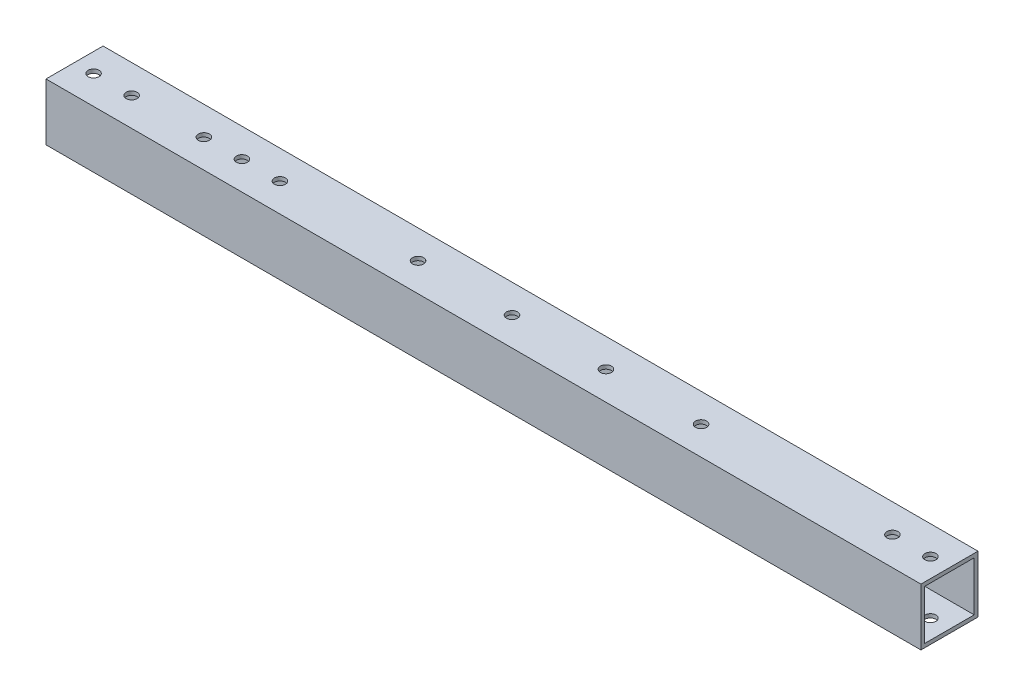
ISO-10303-21;
HEADER;
FILE_DESCRIPTION(('STEP AP214'),'2;1');
FILE_NAME('part.step','',(''),(''),'','','');
FILE_SCHEMA(('AUTOMOTIVE_DESIGN { 1 0 10303 214 1 1 1 1 }'));
ENDSEC;
DATA;
#1=APPLICATION_CONTEXT('core data for automotive mechanical design processes');
#2=APPLICATION_PROTOCOL_DEFINITION('international standard','automotive_design',2000,#1);
#3=PRODUCT_CONTEXT('',#1,'mechanical');
#4=PRODUCT('Part','Part','',(#3));
#5=PRODUCT_RELATED_PRODUCT_CATEGORY('part','',(#4));
#6=PRODUCT_DEFINITION_FORMATION('','',#4);
#7=PRODUCT_DEFINITION_CONTEXT('part definition',#1,'design');
#8=PRODUCT_DEFINITION('design','',#6,#7);
#9=PRODUCT_DEFINITION_SHAPE('','',#8);
#10=(LENGTH_UNIT() NAMED_UNIT(*) SI_UNIT(.MILLI.,.METRE.));
#11=(NAMED_UNIT(*) PLANE_ANGLE_UNIT() SI_UNIT($,.RADIAN.));
#12=(NAMED_UNIT(*) SI_UNIT($,.STERADIAN.) SOLID_ANGLE_UNIT());
#13=UNCERTAINTY_MEASURE_WITH_UNIT(LENGTH_MEASURE(1.E-05),#10,'distance_accuracy_value','');
#14=(GEOMETRIC_REPRESENTATION_CONTEXT(3) GLOBAL_UNCERTAINTY_ASSIGNED_CONTEXT((#13)) GLOBAL_UNIT_ASSIGNED_CONTEXT((#10,
#11,#12)) REPRESENTATION_CONTEXT('',''));
#15=CARTESIAN_POINT('',(0.,0.,0.));
#16=DIRECTION('',(0.,0.,1.));
#17=DIRECTION('',(1.,0.,0.));
#18=AXIS2_PLACEMENT_3D('',#15,#16,#17);
#19=CARTESIAN_POINT('',(230.,0.,0.));
#20=DIRECTION('',(-1.,0.,0.));
#21=DIRECTION('',(0.,0.,1.));
#22=AXIS2_PLACEMENT_3D('',#19,#20,#21);
#23=PLANE('',#22);
#24=DIRECTION('',(0.,1.,0.));
#25=VECTOR('',#24,1.);
#26=CARTESIAN_POINT('',(230.,-7.5,-7.5));
#27=LINE('',#26,#25);
#28=CARTESIAN_POINT('',(230.,-7.5,-7.5));
#29=VERTEX_POINT('',#28);
#30=CARTESIAN_POINT('',(230.,7.5,-7.5));
#31=VERTEX_POINT('',#30);
#32=EDGE_CURVE('E146',#29,#31,#27,.T.);
#33=ORIENTED_EDGE('',*,*,#32,.T.);
#34=DIRECTION('',(0.,0.,1.));
#35=VECTOR('',#34,1.);
#36=CARTESIAN_POINT('',(230.,7.5,7.5));
#37=LINE('',#36,#35);
#38=CARTESIAN_POINT('',(230.,7.5,7.5));
#39=VERTEX_POINT('',#38);
#40=EDGE_CURVE('E149',#31,#39,#37,.T.);
#41=ORIENTED_EDGE('',*,*,#40,.T.);
#42=DIRECTION('',(0.,-1.,0.));
#43=VECTOR('',#42,1.);
#44=CARTESIAN_POINT('',(230.,-7.5,7.5));
#45=LINE('',#44,#43);
#46=CARTESIAN_POINT('',(230.,-7.5,7.5));
#47=VERTEX_POINT('',#46);
#48=EDGE_CURVE('E152',#39,#47,#45,.T.);
#49=ORIENTED_EDGE('',*,*,#48,.T.);
#50=DIRECTION('',(0.,0.,-1.));
#51=VECTOR('',#50,1.);
#52=CARTESIAN_POINT('',(230.,-7.5,7.5));
#53=LINE('',#52,#51);
#54=EDGE_CURVE('E154',#47,#29,#53,.T.);
#55=ORIENTED_EDGE('',*,*,#54,.T.);
#56=EDGE_LOOP('',(#33,#41,#49,#55));
#57=FACE_BOUND('',#56,.T.);
#58=DIRECTION('',(0.,0.,-1.));
#59=VECTOR('',#58,1.);
#60=CARTESIAN_POINT('',(230.,-6.5,6.5));
#61=LINE('',#60,#59);
#62=CARTESIAN_POINT('',(230.,-6.5,6.5));
#63=VERTEX_POINT('',#62);
#64=CARTESIAN_POINT('',(230.,-6.5,-6.5));
#65=VERTEX_POINT('',#64);
#66=EDGE_CURVE('E108',#63,#65,#61,.T.);
#67=ORIENTED_EDGE('',*,*,#66,.F.);
#68=DIRECTION('',(0.,-1.,0.));
#69=VECTOR('',#68,1.);
#70=CARTESIAN_POINT('',(230.,-6.5,6.5));
#71=LINE('',#70,#69);
#72=CARTESIAN_POINT('',(230.,6.5,6.5));
#73=VERTEX_POINT('',#72);
#74=EDGE_CURVE('E130',#73,#63,#71,.T.);
#75=ORIENTED_EDGE('',*,*,#74,.F.);
#76=DIRECTION('',(0.,0.,1.));
#77=VECTOR('',#76,1.);
#78=CARTESIAN_POINT('',(230.,6.5,6.5));
#79=LINE('',#78,#77);
#80=CARTESIAN_POINT('',(230.,6.5,-6.5));
#81=VERTEX_POINT('',#80);
#82=EDGE_CURVE('E128',#81,#73,#79,.T.);
#83=ORIENTED_EDGE('',*,*,#82,.F.);
#84=DIRECTION('',(0.,1.,0.));
#85=VECTOR('',#84,1.);
#86=CARTESIAN_POINT('',(230.,-6.5,-6.5));
#87=LINE('',#86,#85);
#88=EDGE_CURVE('E116',#65,#81,#87,.T.);
#89=ORIENTED_EDGE('',*,*,#88,.F.);
#90=EDGE_LOOP('',(#67,#75,#83,#89));
#91=FACE_BOUND('',#90,.T.);
#92=ADVANCED_FACE('F41',(#57,#91),#23,.F.);
#93=CARTESIAN_POINT('',(0.,0.,0.));
#94=DIRECTION('',(-1.,0.,0.));
#95=DIRECTION('',(0.,0.,1.));
#96=AXIS2_PLACEMENT_3D('',#93,#94,#95);
#97=PLANE('',#96);
#98=DIRECTION('',(0.,1.,0.));
#99=VECTOR('',#98,1.);
#100=CARTESIAN_POINT('',(0.,-7.5,-7.5));
#101=LINE('',#100,#99);
#102=CARTESIAN_POINT('',(0.,-7.5,-7.5));
#103=VERTEX_POINT('',#102);
#104=CARTESIAN_POINT('',(0.,7.5,-7.5));
#105=VERTEX_POINT('',#104);
#106=EDGE_CURVE('E124',#103,#105,#101,.T.);
#107=ORIENTED_EDGE('',*,*,#106,.F.);
#108=DIRECTION('',(0.,0.,-1.));
#109=VECTOR('',#108,1.);
#110=CARTESIAN_POINT('',(0.,-7.5,7.5));
#111=LINE('',#110,#109);
#112=CARTESIAN_POINT('',(0.,-7.5,7.5));
#113=VERTEX_POINT('',#112);
#114=EDGE_CURVE('E150',#113,#103,#111,.T.);
#115=ORIENTED_EDGE('',*,*,#114,.F.);
#116=DIRECTION('',(0.,-1.,0.));
#117=VECTOR('',#116,1.);
#118=CARTESIAN_POINT('',(0.,-7.5,7.5));
#119=LINE('',#118,#117);
#120=CARTESIAN_POINT('',(0.,7.5,7.5));
#121=VERTEX_POINT('',#120);
#122=EDGE_CURVE('E161',#121,#113,#119,.T.);
#123=ORIENTED_EDGE('',*,*,#122,.F.);
#124=DIRECTION('',(0.,0.,1.));
#125=VECTOR('',#124,1.);
#126=CARTESIAN_POINT('',(0.,7.5,7.5));
#127=LINE('',#126,#125);
#128=EDGE_CURVE('E159',#105,#121,#127,.T.);
#129=ORIENTED_EDGE('',*,*,#128,.F.);
#130=EDGE_LOOP('',(#107,#115,#123,#129));
#131=FACE_BOUND('',#130,.T.);
#132=DIRECTION('',(0.,-1.,0.));
#133=VECTOR('',#132,1.);
#134=CARTESIAN_POINT('',(0.,-6.5,6.5));
#135=LINE('',#134,#133);
#136=CARTESIAN_POINT('',(0.,6.5,6.5));
#137=VERTEX_POINT('',#136);
#138=CARTESIAN_POINT('',(0.,-6.5,6.5));
#139=VERTEX_POINT('',#138);
#140=EDGE_CURVE('E117',#137,#139,#135,.T.);
#141=ORIENTED_EDGE('',*,*,#140,.T.);
#142=DIRECTION('',(0.,0.,-1.));
#143=VECTOR('',#142,1.);
#144=CARTESIAN_POINT('',(0.,-6.5,6.5));
#145=LINE('',#144,#143);
#146=CARTESIAN_POINT('',(0.,-6.5,-6.5));
#147=VERTEX_POINT('',#146);
#148=EDGE_CURVE('E66',#139,#147,#145,.T.);
#149=ORIENTED_EDGE('',*,*,#148,.T.);
#150=DIRECTION('',(0.,1.,0.));
#151=VECTOR('',#150,1.);
#152=CARTESIAN_POINT('',(0.,-6.5,-6.5));
#153=LINE('',#152,#151);
#154=CARTESIAN_POINT('',(0.,6.5,-6.5));
#155=VERTEX_POINT('',#154);
#156=EDGE_CURVE('E123',#147,#155,#153,.T.);
#157=ORIENTED_EDGE('',*,*,#156,.T.);
#158=DIRECTION('',(0.,0.,1.));
#159=VECTOR('',#158,1.);
#160=CARTESIAN_POINT('',(0.,6.5,6.5));
#161=LINE('',#160,#159);
#162=EDGE_CURVE('E138',#155,#137,#161,.T.);
#163=ORIENTED_EDGE('',*,*,#162,.T.);
#164=EDGE_LOOP('',(#141,#149,#157,#163));
#165=FACE_BOUND('',#164,.T.);
#166=ADVANCED_FACE('F255',(#131,#165),#97,.T.);
#167=CARTESIAN_POINT('',(230.,-7.5,-7.5));
#168=DIRECTION('',(0.,0.,1.));
#169=DIRECTION('',(1.,0.,0.));
#170=AXIS2_PLACEMENT_3D('',#167,#168,#169);
#171=PLANE('',#170);
#172=ORIENTED_EDGE('',*,*,#106,.T.);
#173=DIRECTION('',(-1.,0.,0.));
#174=VECTOR('',#173,1.);
#175=CARTESIAN_POINT('',(230.,7.5,-7.5));
#176=LINE('',#175,#174);
#177=EDGE_CURVE('E11',#31,#105,#176,.T.);
#178=ORIENTED_EDGE('',*,*,#177,.F.);
#179=ORIENTED_EDGE('',*,*,#32,.F.);
#180=DIRECTION('',(-1.,0.,0.));
#181=VECTOR('',#180,1.);
#182=CARTESIAN_POINT('',(230.,-7.5,-7.5));
#183=LINE('',#182,#181);
#184=EDGE_CURVE('E156',#29,#103,#183,.T.);
#185=ORIENTED_EDGE('',*,*,#184,.T.);
#186=EDGE_LOOP('',(#172,#178,#179,#185));
#187=FACE_BOUND('',#186,.T.);
#188=ADVANCED_FACE('F43',(#187),#171,.F.);
#189=CARTESIAN_POINT('',(230.,7.5,7.5));
#190=DIRECTION('',(0.,-1.,0.));
#191=DIRECTION('',(0.,0.,-1.));
#192=AXIS2_PLACEMENT_3D('',#189,#190,#191);
#193=PLANE('',#192);
#194=CARTESIAN_POINT('',(15.0000000000002,7.5,0.));
#195=DIRECTION('',(0.,-1.,0.));
#196=DIRECTION('',(0.,0.,-1.));
#197=AXIS2_PLACEMENT_3D('',#194,#195,#196);
#198=CIRCLE('',#197,1.45);
#199=CARTESIAN_POINT('',(15.0000000000002,7.5,-1.44999999999995));
#200=VERTEX_POINT('',#199);
#201=EDGE_CURVE('E295',#200,#200,#198,.T.);
#202=ORIENTED_EDGE('',*,*,#201,.T.);
#203=EDGE_LOOP('',(#202));
#204=FACE_BOUND('',#203,.T.);
#205=CARTESIAN_POINT('',(115.,7.5,0.));
#206=DIRECTION('',(0.,-1.,0.));
#207=DIRECTION('',(0.,0.,-1.));
#208=AXIS2_PLACEMENT_3D('',#205,#206,#207);
#209=CIRCLE('',#208,1.45);
#210=CARTESIAN_POINT('',(115.,7.5,-1.44999999999998));
#211=VERTEX_POINT('',#210);
#212=EDGE_CURVE('E299',#211,#211,#209,.T.);
#213=ORIENTED_EDGE('',*,*,#212,.T.);
#214=EDGE_LOOP('',(#213));
#215=FACE_BOUND('',#214,.T.);
#216=CARTESIAN_POINT('',(90.3,7.5,0.));
#217=DIRECTION('',(0.,-1.,0.));
#218=DIRECTION('',(0.,0.,-1.));
#219=AXIS2_PLACEMENT_3D('',#216,#217,#218);
#220=CIRCLE('',#219,1.45);
#221=CARTESIAN_POINT('',(90.3,7.5,-1.44999999999996));
#222=VERTEX_POINT('',#221);
#223=EDGE_CURVE('E303',#222,#222,#220,.T.);
#224=ORIENTED_EDGE('',*,*,#223,.T.);
#225=EDGE_LOOP('',(#224));
#226=FACE_BOUND('',#225,.T.);
#227=CARTESIAN_POINT('',(34.0000000000003,7.5,0.));
#228=DIRECTION('',(0.,-1.,0.));
#229=DIRECTION('',(0.,0.,-1.));
#230=AXIS2_PLACEMENT_3D('',#227,#228,#229);
#231=CIRCLE('',#230,1.45);
#232=CARTESIAN_POINT('',(34.0000000000003,7.5,-1.45));
#233=VERTEX_POINT('',#232);
#234=EDGE_CURVE('E307',#233,#233,#231,.T.);
#235=ORIENTED_EDGE('',*,*,#234,.T.);
#236=EDGE_LOOP('',(#235));
#237=FACE_BOUND('',#236,.T.);
#238=CARTESIAN_POINT('',(5.00000000000025,7.5,0.));
#239=DIRECTION('',(0.,-1.,0.));
#240=DIRECTION('',(0.,0.,-1.));
#241=AXIS2_PLACEMENT_3D('',#238,#239,#240);
#242=CIRCLE('',#241,1.45);
#243=CARTESIAN_POINT('',(5.00000000000025,7.5,-1.44999999999995));
#244=VERTEX_POINT('',#243);
#245=EDGE_CURVE('E311',#244,#244,#242,.T.);
#246=ORIENTED_EDGE('',*,*,#245,.T.);
#247=EDGE_LOOP('',(#246));
#248=FACE_BOUND('',#247,.T.);
#249=CARTESIAN_POINT('',(139.698484809868,7.5,0.));
#250=DIRECTION('',(0.,-1.,0.));
#251=DIRECTION('',(0.,0.,-1.));
#252=AXIS2_PLACEMENT_3D('',#249,#250,#251);
#253=CIRCLE('',#252,1.45);
#254=CARTESIAN_POINT('',(139.698484809868,7.5,-1.45));
#255=VERTEX_POINT('',#254);
#256=EDGE_CURVE('E315',#255,#255,#253,.T.);
#257=ORIENTED_EDGE('',*,*,#256,.T.);
#258=EDGE_LOOP('',(#257));
#259=FACE_BOUND('',#258,.T.);
#260=CARTESIAN_POINT('',(164.698484809868,7.5,0.));
#261=DIRECTION('',(0.,-1.,0.));
#262=DIRECTION('',(0.,0.,-1.));
#263=AXIS2_PLACEMENT_3D('',#260,#261,#262);
#264=CIRCLE('',#263,1.45);
#265=CARTESIAN_POINT('',(164.698484809868,7.5,-1.45));
#266=VERTEX_POINT('',#265);
#267=EDGE_CURVE('E319',#266,#266,#264,.T.);
#268=ORIENTED_EDGE('',*,*,#267,.T.);
#269=EDGE_LOOP('',(#268));
#270=FACE_BOUND('',#269,.T.);
#271=CARTESIAN_POINT('',(225.,7.5,0.));
#272=DIRECTION('',(0.,-1.,0.));
#273=DIRECTION('',(0.,0.,-1.));
#274=AXIS2_PLACEMENT_3D('',#271,#272,#273);
#275=CIRCLE('',#274,1.45);
#276=CARTESIAN_POINT('',(225.,7.5,-1.45000000000002));
#277=VERTEX_POINT('',#276);
#278=EDGE_CURVE('E323',#277,#277,#275,.T.);
#279=ORIENTED_EDGE('',*,*,#278,.T.);
#280=EDGE_LOOP('',(#279));
#281=FACE_BOUND('',#280,.T.);
#282=CARTESIAN_POINT('',(44.0000000000003,7.5,0.));
#283=DIRECTION('',(0.,-1.,0.));
#284=DIRECTION('',(0.,0.,-1.));
#285=AXIS2_PLACEMENT_3D('',#282,#283,#284);
#286=CIRCLE('',#285,1.45);
#287=CARTESIAN_POINT('',(44.0000000000003,7.5,-1.45));
#288=VERTEX_POINT('',#287);
#289=EDGE_CURVE('E327',#288,#288,#286,.T.);
#290=ORIENTED_EDGE('',*,*,#289,.T.);
#291=EDGE_LOOP('',(#290));
#292=FACE_BOUND('',#291,.T.);
#293=CARTESIAN_POINT('',(54.0000000000003,7.5,0.));
#294=DIRECTION('',(0.,-1.,0.));
#295=DIRECTION('',(0.,0.,-1.));
#296=AXIS2_PLACEMENT_3D('',#293,#294,#295);
#297=CIRCLE('',#296,1.45);
#298=CARTESIAN_POINT('',(54.0000000000003,7.5,-1.45));
#299=VERTEX_POINT('',#298);
#300=EDGE_CURVE('E331',#299,#299,#297,.T.);
#301=ORIENTED_EDGE('',*,*,#300,.T.);
#302=EDGE_LOOP('',(#301));
#303=FACE_BOUND('',#302,.T.);
#304=CARTESIAN_POINT('',(215.,7.5,0.));
#305=DIRECTION('',(0.,-1.,0.));
#306=DIRECTION('',(0.,0.,-1.));
#307=AXIS2_PLACEMENT_3D('',#304,#305,#306);
#308=CIRCLE('',#307,1.45);
#309=CARTESIAN_POINT('',(215.,7.5,-1.45000000000002));
#310=VERTEX_POINT('',#309);
#311=EDGE_CURVE('E175',#310,#310,#308,.T.);
#312=ORIENTED_EDGE('',*,*,#311,.T.);
#313=EDGE_LOOP('',(#312));
#314=FACE_BOUND('',#313,.T.);
#315=ORIENTED_EDGE('',*,*,#128,.T.);
#316=DIRECTION('',(-1.,0.,0.));
#317=VECTOR('',#316,1.);
#318=CARTESIAN_POINT('',(230.,7.5,7.5));
#319=LINE('',#318,#317);
#320=EDGE_CURVE('E50',#39,#121,#319,.T.);
#321=ORIENTED_EDGE('',*,*,#320,.F.);
#322=ORIENTED_EDGE('',*,*,#40,.F.);
#323=ORIENTED_EDGE('',*,*,#177,.T.);
#324=EDGE_LOOP('',(#315,#321,#322,#323));
#325=FACE_BOUND('',#324,.T.);
#326=ADVANCED_FACE('F285',(#204,#215,#226,#237,#248,#259,#270,#281,#292,#303,#314,#325),#193,.F.);
#327=CARTESIAN_POINT('',(230.,-7.5,7.5));
#328=DIRECTION('',(0.,0.,-1.));
#329=DIRECTION('',(-1.,0.,0.));
#330=AXIS2_PLACEMENT_3D('',#327,#328,#329);
#331=PLANE('',#330);
#332=ORIENTED_EDGE('',*,*,#122,.T.);
#333=DIRECTION('',(-1.,0.,0.));
#334=VECTOR('',#333,1.);
#335=CARTESIAN_POINT('',(230.,-7.5,7.5));
#336=LINE('',#335,#334);
#337=EDGE_CURVE('E166',#47,#113,#336,.T.);
#338=ORIENTED_EDGE('',*,*,#337,.F.);
#339=ORIENTED_EDGE('',*,*,#48,.F.);
#340=ORIENTED_EDGE('',*,*,#320,.T.);
#341=EDGE_LOOP('',(#332,#338,#339,#340));
#342=FACE_BOUND('',#341,.T.);
#343=ADVANCED_FACE('F282',(#342),#331,.F.);
#344=CARTESIAN_POINT('',(230.,-7.5,7.5));
#345=DIRECTION('',(0.,1.,0.));
#346=DIRECTION('',(0.,0.,1.));
#347=AXIS2_PLACEMENT_3D('',#344,#345,#346);
#348=PLANE('',#347);
#349=CARTESIAN_POINT('',(15.0000000000002,-7.5,0.));
#350=DIRECTION('',(0.,-1.,0.));
#351=DIRECTION('',(0.,0.,-1.));
#352=AXIS2_PLACEMENT_3D('',#349,#350,#351);
#353=CIRCLE('',#352,1.45);
#354=CARTESIAN_POINT('',(15.0000000000002,-7.5,-1.44999999999995));
#355=VERTEX_POINT('',#354);
#356=EDGE_CURVE('E469',#355,#355,#353,.T.);
#357=ORIENTED_EDGE('',*,*,#356,.F.);
#358=EDGE_LOOP('',(#357));
#359=FACE_BOUND('',#358,.T.);
#360=CARTESIAN_POINT('',(115.,-7.5,0.));
#361=DIRECTION('',(0.,-1.,0.));
#362=DIRECTION('',(0.,0.,-1.));
#363=AXIS2_PLACEMENT_3D('',#360,#361,#362);
#364=CIRCLE('',#363,1.45);
#365=CARTESIAN_POINT('',(115.,-7.5,-1.44999999999998));
#366=VERTEX_POINT('',#365);
#367=EDGE_CURVE('E473',#366,#366,#364,.T.);
#368=ORIENTED_EDGE('',*,*,#367,.F.);
#369=EDGE_LOOP('',(#368));
#370=FACE_BOUND('',#369,.T.);
#371=CARTESIAN_POINT('',(90.3,-7.5,0.));
#372=DIRECTION('',(0.,-1.,0.));
#373=DIRECTION('',(0.,0.,-1.));
#374=AXIS2_PLACEMENT_3D('',#371,#372,#373);
#375=CIRCLE('',#374,1.45);
#376=CARTESIAN_POINT('',(90.3,-7.5,-1.44999999999996));
#377=VERTEX_POINT('',#376);
#378=EDGE_CURVE('E463',#377,#377,#375,.T.);
#379=ORIENTED_EDGE('',*,*,#378,.F.);
#380=EDGE_LOOP('',(#379));
#381=FACE_BOUND('',#380,.T.);
#382=CARTESIAN_POINT('',(34.0000000000003,-7.5,0.));
#383=DIRECTION('',(0.,-1.,0.));
#384=DIRECTION('',(0.,0.,-1.));
#385=AXIS2_PLACEMENT_3D('',#382,#383,#384);
#386=CIRCLE('',#385,1.45);
#387=CARTESIAN_POINT('',(34.0000000000003,-7.5,-1.45));
#388=VERTEX_POINT('',#387);
#389=EDGE_CURVE('E455',#388,#388,#386,.T.);
#390=ORIENTED_EDGE('',*,*,#389,.F.);
#391=EDGE_LOOP('',(#390));
#392=FACE_BOUND('',#391,.T.);
#393=CARTESIAN_POINT('',(5.00000000000025,-7.5,0.));
#394=DIRECTION('',(0.,-1.,0.));
#395=DIRECTION('',(0.,0.,-1.));
#396=AXIS2_PLACEMENT_3D('',#393,#394,#395);
#397=CIRCLE('',#396,1.45);
#398=CARTESIAN_POINT('',(5.00000000000025,-7.5,-1.44999999999995));
#399=VERTEX_POINT('',#398);
#400=EDGE_CURVE('E487',#399,#399,#397,.T.);
#401=ORIENTED_EDGE('',*,*,#400,.F.);
#402=EDGE_LOOP('',(#401));
#403=FACE_BOUND('',#402,.T.);
#404=CARTESIAN_POINT('',(139.698484809868,-7.5,0.));
#405=DIRECTION('',(0.,-1.,0.));
#406=DIRECTION('',(0.,0.,-1.));
#407=AXIS2_PLACEMENT_3D('',#404,#405,#406);
#408=CIRCLE('',#407,1.45);
#409=CARTESIAN_POINT('',(139.698484809868,-7.5,-1.45));
#410=VERTEX_POINT('',#409);
#411=EDGE_CURVE('E484',#410,#410,#408,.T.);
#412=ORIENTED_EDGE('',*,*,#411,.F.);
#413=EDGE_LOOP('',(#412));
#414=FACE_BOUND('',#413,.T.);
#415=CARTESIAN_POINT('',(164.698484809868,-7.5,0.));
#416=DIRECTION('',(0.,-1.,0.));
#417=DIRECTION('',(0.,0.,-1.));
#418=AXIS2_PLACEMENT_3D('',#415,#416,#417);
#419=CIRCLE('',#418,1.45);
#420=CARTESIAN_POINT('',(164.698484809868,-7.5,-1.45));
#421=VERTEX_POINT('',#420);
#422=EDGE_CURVE('E480',#421,#421,#419,.T.);
#423=ORIENTED_EDGE('',*,*,#422,.F.);
#424=EDGE_LOOP('',(#423));
#425=FACE_BOUND('',#424,.T.);
#426=CARTESIAN_POINT('',(225.,-7.5,0.));
#427=DIRECTION('',(0.,-1.,0.));
#428=DIRECTION('',(0.,0.,-1.));
#429=AXIS2_PLACEMENT_3D('',#426,#427,#428);
#430=CIRCLE('',#429,1.45);
#431=CARTESIAN_POINT('',(225.,-7.5,-1.45000000000002));
#432=VERTEX_POINT('',#431);
#433=EDGE_CURVE('E350',#432,#432,#430,.T.);
#434=ORIENTED_EDGE('',*,*,#433,.F.);
#435=EDGE_LOOP('',(#434));
#436=FACE_BOUND('',#435,.T.);
#437=CARTESIAN_POINT('',(44.0000000000003,-7.5,0.));
#438=DIRECTION('',(0.,-1.,0.));
#439=DIRECTION('',(0.,0.,-1.));
#440=AXIS2_PLACEMENT_3D('',#437,#438,#439);
#441=CIRCLE('',#440,1.45);
#442=CARTESIAN_POINT('',(44.0000000000003,-7.5,-1.45));
#443=VERTEX_POINT('',#442);
#444=EDGE_CURVE('E452',#443,#443,#441,.T.);
#445=ORIENTED_EDGE('',*,*,#444,.F.);
#446=EDGE_LOOP('',(#445));
#447=FACE_BOUND('',#446,.T.);
#448=CARTESIAN_POINT('',(54.0000000000003,-7.5,0.));
#449=DIRECTION('',(0.,-1.,0.));
#450=DIRECTION('',(0.,0.,-1.));
#451=AXIS2_PLACEMENT_3D('',#448,#449,#450);
#452=CIRCLE('',#451,1.45);
#453=CARTESIAN_POINT('',(54.0000000000003,-7.5,-1.45));
#454=VERTEX_POINT('',#453);
#455=EDGE_CURVE('E457',#454,#454,#452,.T.);
#456=ORIENTED_EDGE('',*,*,#455,.F.);
#457=EDGE_LOOP('',(#456));
#458=FACE_BOUND('',#457,.T.);
#459=CARTESIAN_POINT('',(215.,-7.5,0.));
#460=DIRECTION('',(0.,-1.,0.));
#461=DIRECTION('',(0.,0.,-1.));
#462=AXIS2_PLACEMENT_3D('',#459,#460,#461);
#463=CIRCLE('',#462,1.45);
#464=CARTESIAN_POINT('',(215.,-7.5,-1.45000000000002));
#465=VERTEX_POINT('',#464);
#466=EDGE_CURVE('E347',#465,#465,#463,.T.);
#467=ORIENTED_EDGE('',*,*,#466,.F.);
#468=EDGE_LOOP('',(#467));
#469=FACE_BOUND('',#468,.T.);
#470=ORIENTED_EDGE('',*,*,#114,.T.);
#471=ORIENTED_EDGE('',*,*,#184,.F.);
#472=ORIENTED_EDGE('',*,*,#54,.F.);
#473=ORIENTED_EDGE('',*,*,#337,.T.);
#474=EDGE_LOOP('',(#470,#471,#472,#473));
#475=FACE_BOUND('',#474,.T.);
#476=ADVANCED_FACE('F279',(#359,#370,#381,#392,#403,#414,#425,#436,#447,#458,#469,#475),#348,.F.);
#477=CARTESIAN_POINT('',(230.,-6.5,6.5));
#478=DIRECTION('',(0.,1.,0.));
#479=DIRECTION('',(0.,0.,1.));
#480=AXIS2_PLACEMENT_3D('',#477,#478,#479);
#481=PLANE('',#480);
#482=CARTESIAN_POINT('',(15.0000000000002,-6.5,0.));
#483=DIRECTION('',(0.,1.,0.));
#484=DIRECTION('',(0.,0.,1.));
#485=AXIS2_PLACEMENT_3D('',#482,#483,#484);
#486=CIRCLE('',#485,1.45);
#487=CARTESIAN_POINT('',(15.0000000000002,-6.5,1.45000000000005));
#488=VERTEX_POINT('',#487);
#489=EDGE_CURVE('E136',#488,#488,#486,.T.);
#490=ORIENTED_EDGE('',*,*,#489,.F.);
#491=EDGE_LOOP('',(#490));
#492=FACE_BOUND('',#491,.T.);
#493=CARTESIAN_POINT('',(115.,-6.5,0.));
#494=DIRECTION('',(0.,1.,0.));
#495=DIRECTION('',(0.,0.,1.));
#496=AXIS2_PLACEMENT_3D('',#493,#494,#495);
#497=CIRCLE('',#496,1.45);
#498=CARTESIAN_POINT('',(115.,-6.5,1.45000000000002));
#499=VERTEX_POINT('',#498);
#500=EDGE_CURVE('E209',#499,#499,#497,.T.);
#501=ORIENTED_EDGE('',*,*,#500,.F.);
#502=EDGE_LOOP('',(#501));
#503=FACE_BOUND('',#502,.T.);
#504=CARTESIAN_POINT('',(90.3,-6.5,0.));
#505=DIRECTION('',(0.,1.,0.));
#506=DIRECTION('',(0.,0.,1.));
#507=AXIS2_PLACEMENT_3D('',#504,#505,#506);
#508=CIRCLE('',#507,1.45);
#509=CARTESIAN_POINT('',(90.3,-6.5,1.45000000000003));
#510=VERTEX_POINT('',#509);
#511=EDGE_CURVE('E206',#510,#510,#508,.T.);
#512=ORIENTED_EDGE('',*,*,#511,.F.);
#513=EDGE_LOOP('',(#512));
#514=FACE_BOUND('',#513,.T.);
#515=CARTESIAN_POINT('',(34.0000000000003,-6.5,0.));
#516=DIRECTION('',(0.,1.,0.));
#517=DIRECTION('',(0.,0.,1.));
#518=AXIS2_PLACEMENT_3D('',#515,#516,#517);
#519=CIRCLE('',#518,1.45);
#520=CARTESIAN_POINT('',(34.0000000000003,-6.5,1.45));
#521=VERTEX_POINT('',#520);
#522=EDGE_CURVE('E203',#521,#521,#519,.T.);
#523=ORIENTED_EDGE('',*,*,#522,.F.);
#524=EDGE_LOOP('',(#523));
#525=FACE_BOUND('',#524,.T.);
#526=CARTESIAN_POINT('',(5.00000000000025,-6.5,0.));
#527=DIRECTION('',(0.,1.,0.));
#528=DIRECTION('',(0.,0.,1.));
#529=AXIS2_PLACEMENT_3D('',#526,#527,#528);
#530=CIRCLE('',#529,1.45);
#531=CARTESIAN_POINT('',(5.00000000000025,-6.5,1.45000000000005));
#532=VERTEX_POINT('',#531);
#533=EDGE_CURVE('E199',#532,#532,#530,.T.);
#534=ORIENTED_EDGE('',*,*,#533,.F.);
#535=EDGE_LOOP('',(#534));
#536=FACE_BOUND('',#535,.T.);
#537=CARTESIAN_POINT('',(139.698484809868,-6.5,0.));
#538=DIRECTION('',(0.,1.,0.));
#539=DIRECTION('',(0.,0.,1.));
#540=AXIS2_PLACEMENT_3D('',#537,#538,#539);
#541=CIRCLE('',#540,1.45);
#542=CARTESIAN_POINT('',(139.698484809868,-6.5,1.45));
#543=VERTEX_POINT('',#542);
#544=EDGE_CURVE('E195',#543,#543,#541,.T.);
#545=ORIENTED_EDGE('',*,*,#544,.F.);
#546=EDGE_LOOP('',(#545));
#547=FACE_BOUND('',#546,.T.);
#548=CARTESIAN_POINT('',(164.698484809868,-6.5,0.));
#549=DIRECTION('',(0.,1.,0.));
#550=DIRECTION('',(0.,0.,1.));
#551=AXIS2_PLACEMENT_3D('',#548,#549,#550);
#552=CIRCLE('',#551,1.45);
#553=CARTESIAN_POINT('',(164.698484809868,-6.5,1.45));
#554=VERTEX_POINT('',#553);
#555=EDGE_CURVE('E191',#554,#554,#552,.T.);
#556=ORIENTED_EDGE('',*,*,#555,.F.);
#557=EDGE_LOOP('',(#556));
#558=FACE_BOUND('',#557,.T.);
#559=CARTESIAN_POINT('',(225.,-6.5,0.));
#560=DIRECTION('',(0.,1.,0.));
#561=DIRECTION('',(0.,0.,1.));
#562=AXIS2_PLACEMENT_3D('',#559,#560,#561);
#563=CIRCLE('',#562,1.45);
#564=CARTESIAN_POINT('',(225.,-6.5,1.44999999999998));
#565=VERTEX_POINT('',#564);
#566=EDGE_CURVE('E187',#565,#565,#563,.T.);
#567=ORIENTED_EDGE('',*,*,#566,.F.);
#568=EDGE_LOOP('',(#567));
#569=FACE_BOUND('',#568,.T.);
#570=CARTESIAN_POINT('',(44.0000000000003,-6.5,0.));
#571=DIRECTION('',(0.,1.,0.));
#572=DIRECTION('',(0.,0.,1.));
#573=AXIS2_PLACEMENT_3D('',#570,#571,#572);
#574=CIRCLE('',#573,1.45);
#575=CARTESIAN_POINT('',(44.0000000000003,-6.5,1.45));
#576=VERTEX_POINT('',#575);
#577=EDGE_CURVE('E183',#576,#576,#574,.T.);
#578=ORIENTED_EDGE('',*,*,#577,.F.);
#579=EDGE_LOOP('',(#578));
#580=FACE_BOUND('',#579,.T.);
#581=CARTESIAN_POINT('',(54.0000000000003,-6.5,0.));
#582=DIRECTION('',(0.,1.,0.));
#583=DIRECTION('',(0.,0.,1.));
#584=AXIS2_PLACEMENT_3D('',#581,#582,#583);
#585=CIRCLE('',#584,1.45);
#586=CARTESIAN_POINT('',(54.0000000000003,-6.5,1.45));
#587=VERTEX_POINT('',#586);
#588=EDGE_CURVE('E179',#587,#587,#585,.T.);
#589=ORIENTED_EDGE('',*,*,#588,.F.);
#590=EDGE_LOOP('',(#589));
#591=FACE_BOUND('',#590,.T.);
#592=CARTESIAN_POINT('',(215.,-6.5,0.));
#593=DIRECTION('',(0.,1.,0.));
#594=DIRECTION('',(0.,0.,1.));
#595=AXIS2_PLACEMENT_3D('',#592,#593,#594);
#596=CIRCLE('',#595,1.45);
#597=CARTESIAN_POINT('',(215.,-6.5,1.44999999999998));
#598=VERTEX_POINT('',#597);
#599=EDGE_CURVE('E174',#598,#598,#596,.T.);
#600=ORIENTED_EDGE('',*,*,#599,.F.);
#601=EDGE_LOOP('',(#600));
#602=FACE_BOUND('',#601,.T.);
#603=ORIENTED_EDGE('',*,*,#148,.F.);
#604=DIRECTION('',(-1.,0.,0.));
#605=VECTOR('',#604,1.);
#606=CARTESIAN_POINT('',(230.,-6.5,6.5));
#607=LINE('',#606,#605);
#608=EDGE_CURVE('E112',#63,#139,#607,.T.);
#609=ORIENTED_EDGE('',*,*,#608,.F.);
#610=ORIENTED_EDGE('',*,*,#66,.T.);
#611=DIRECTION('',(-1.,0.,0.));
#612=VECTOR('',#611,1.);
#613=CARTESIAN_POINT('',(230.,-6.5,-6.5));
#614=LINE('',#613,#612);
#615=EDGE_CURVE('E111',#65,#147,#614,.T.);
#616=ORIENTED_EDGE('',*,*,#615,.T.);
#617=EDGE_LOOP('',(#603,#609,#610,#616));
#618=FACE_BOUND('',#617,.T.);
#619=ADVANCED_FACE('F110',(#492,#503,#514,#525,#536,#547,#558,#569,#580,#591,#602,#618),#481,.T.);
#620=CARTESIAN_POINT('',(230.,-6.5,-6.5));
#621=DIRECTION('',(0.,0.,1.));
#622=DIRECTION('',(0.,-1.,0.));
#623=AXIS2_PLACEMENT_3D('',#620,#621,#622);
#624=PLANE('',#623);
#625=ORIENTED_EDGE('',*,*,#156,.F.);
#626=ORIENTED_EDGE('',*,*,#615,.F.);
#627=ORIENTED_EDGE('',*,*,#88,.T.);
#628=DIRECTION('',(-1.,0.,0.));
#629=VECTOR('',#628,1.);
#630=CARTESIAN_POINT('',(230.,6.5,-6.5));
#631=LINE('',#630,#629);
#632=EDGE_CURVE('E125',#81,#155,#631,.T.);
#633=ORIENTED_EDGE('',*,*,#632,.T.);
#634=EDGE_LOOP('',(#625,#626,#627,#633));
#635=FACE_BOUND('',#634,.T.);
#636=ADVANCED_FACE('F120',(#635),#624,.T.);
#637=CARTESIAN_POINT('',(230.,6.5,6.5));
#638=DIRECTION('',(0.,-1.,0.));
#639=DIRECTION('',(0.,0.,-1.));
#640=AXIS2_PLACEMENT_3D('',#637,#638,#639);
#641=PLANE('',#640);
#642=CARTESIAN_POINT('',(15.0000000000002,6.5,0.));
#643=DIRECTION('',(0.,-1.,0.));
#644=DIRECTION('',(0.,0.,-1.));
#645=AXIS2_PLACEMENT_3D('',#642,#643,#644);
#646=CIRCLE('',#645,1.45);
#647=CARTESIAN_POINT('',(15.0000000000002,6.5,-1.44999999999995));
#648=VERTEX_POINT('',#647);
#649=EDGE_CURVE('E45',#648,#648,#646,.T.);
#650=ORIENTED_EDGE('',*,*,#649,.F.);
#651=EDGE_LOOP('',(#650));
#652=FACE_BOUND('',#651,.T.);
#653=CARTESIAN_POINT('',(115.,6.5,0.));
#654=DIRECTION('',(0.,-1.,0.));
#655=DIRECTION('',(0.,0.,-1.));
#656=AXIS2_PLACEMENT_3D('',#653,#654,#655);
#657=CIRCLE('',#656,1.45);
#658=CARTESIAN_POINT('',(115.,6.5,-1.44999999999998));
#659=VERTEX_POINT('',#658);
#660=EDGE_CURVE('E207',#659,#659,#657,.T.);
#661=ORIENTED_EDGE('',*,*,#660,.F.);
#662=EDGE_LOOP('',(#661));
#663=FACE_BOUND('',#662,.T.);
#664=CARTESIAN_POINT('',(90.3,6.5,0.));
#665=DIRECTION('',(0.,-1.,0.));
#666=DIRECTION('',(0.,0.,-1.));
#667=AXIS2_PLACEMENT_3D('',#664,#665,#666);
#668=CIRCLE('',#667,1.45);
#669=CARTESIAN_POINT('',(90.3,6.5,-1.44999999999996));
#670=VERTEX_POINT('',#669);
#671=EDGE_CURVE('E204',#670,#670,#668,.T.);
#672=ORIENTED_EDGE('',*,*,#671,.F.);
#673=EDGE_LOOP('',(#672));
#674=FACE_BOUND('',#673,.T.);
#675=CARTESIAN_POINT('',(34.0000000000003,6.5,0.));
#676=DIRECTION('',(0.,-1.,0.));
#677=DIRECTION('',(0.,0.,-1.));
#678=AXIS2_PLACEMENT_3D('',#675,#676,#677);
#679=CIRCLE('',#678,1.45);
#680=CARTESIAN_POINT('',(34.0000000000003,6.5,-1.45));
#681=VERTEX_POINT('',#680);
#682=EDGE_CURVE('E200',#681,#681,#679,.T.);
#683=ORIENTED_EDGE('',*,*,#682,.F.);
#684=EDGE_LOOP('',(#683));
#685=FACE_BOUND('',#684,.T.);
#686=CARTESIAN_POINT('',(5.00000000000025,6.5,0.));
#687=DIRECTION('',(0.,-1.,0.));
#688=DIRECTION('',(0.,0.,-1.));
#689=AXIS2_PLACEMENT_3D('',#686,#687,#688);
#690=CIRCLE('',#689,1.45);
#691=CARTESIAN_POINT('',(5.00000000000025,6.5,-1.44999999999995));
#692=VERTEX_POINT('',#691);
#693=EDGE_CURVE('E196',#692,#692,#690,.T.);
#694=ORIENTED_EDGE('',*,*,#693,.F.);
#695=EDGE_LOOP('',(#694));
#696=FACE_BOUND('',#695,.T.);
#697=CARTESIAN_POINT('',(139.698484809868,6.5,0.));
#698=DIRECTION('',(0.,-1.,0.));
#699=DIRECTION('',(0.,0.,-1.));
#700=AXIS2_PLACEMENT_3D('',#697,#698,#699);
#701=CIRCLE('',#700,1.45);
#702=CARTESIAN_POINT('',(139.698484809868,6.5,-1.45));
#703=VERTEX_POINT('',#702);
#704=EDGE_CURVE('E192',#703,#703,#701,.T.);
#705=ORIENTED_EDGE('',*,*,#704,.F.);
#706=EDGE_LOOP('',(#705));
#707=FACE_BOUND('',#706,.T.);
#708=CARTESIAN_POINT('',(164.698484809868,6.5,0.));
#709=DIRECTION('',(0.,-1.,0.));
#710=DIRECTION('',(0.,0.,-1.));
#711=AXIS2_PLACEMENT_3D('',#708,#709,#710);
#712=CIRCLE('',#711,1.45);
#713=CARTESIAN_POINT('',(164.698484809868,6.5,-1.45));
#714=VERTEX_POINT('',#713);
#715=EDGE_CURVE('E188',#714,#714,#712,.T.);
#716=ORIENTED_EDGE('',*,*,#715,.F.);
#717=EDGE_LOOP('',(#716));
#718=FACE_BOUND('',#717,.T.);
#719=CARTESIAN_POINT('',(225.,6.5,0.));
#720=DIRECTION('',(0.,-1.,0.));
#721=DIRECTION('',(0.,0.,-1.));
#722=AXIS2_PLACEMENT_3D('',#719,#720,#721);
#723=CIRCLE('',#722,1.45);
#724=CARTESIAN_POINT('',(225.,6.5,-1.45000000000002));
#725=VERTEX_POINT('',#724);
#726=EDGE_CURVE('E184',#725,#725,#723,.T.);
#727=ORIENTED_EDGE('',*,*,#726,.F.);
#728=EDGE_LOOP('',(#727));
#729=FACE_BOUND('',#728,.T.);
#730=CARTESIAN_POINT('',(44.0000000000003,6.5,0.));
#731=DIRECTION('',(0.,-1.,0.));
#732=DIRECTION('',(0.,0.,-1.));
#733=AXIS2_PLACEMENT_3D('',#730,#731,#732);
#734=CIRCLE('',#733,1.45);
#735=CARTESIAN_POINT('',(44.0000000000003,6.5,-1.45));
#736=VERTEX_POINT('',#735);
#737=EDGE_CURVE('E180',#736,#736,#734,.T.);
#738=ORIENTED_EDGE('',*,*,#737,.F.);
#739=EDGE_LOOP('',(#738));
#740=FACE_BOUND('',#739,.T.);
#741=CARTESIAN_POINT('',(54.0000000000003,6.5,0.));
#742=DIRECTION('',(0.,-1.,0.));
#743=DIRECTION('',(0.,0.,-1.));
#744=AXIS2_PLACEMENT_3D('',#741,#742,#743);
#745=CIRCLE('',#744,1.45);
#746=CARTESIAN_POINT('',(54.0000000000003,6.5,-1.45));
#747=VERTEX_POINT('',#746);
#748=EDGE_CURVE('E176',#747,#747,#745,.T.);
#749=ORIENTED_EDGE('',*,*,#748,.F.);
#750=EDGE_LOOP('',(#749));
#751=FACE_BOUND('',#750,.T.);
#752=CARTESIAN_POINT('',(215.,6.5,0.));
#753=DIRECTION('',(0.,-1.,0.));
#754=DIRECTION('',(0.,0.,-1.));
#755=AXIS2_PLACEMENT_3D('',#752,#753,#754);
#756=CIRCLE('',#755,1.45);
#757=CARTESIAN_POINT('',(215.,6.5,-1.45000000000002));
#758=VERTEX_POINT('',#757);
#759=EDGE_CURVE('E171',#758,#758,#756,.T.);
#760=ORIENTED_EDGE('',*,*,#759,.F.);
#761=EDGE_LOOP('',(#760));
#762=FACE_BOUND('',#761,.T.);
#763=ORIENTED_EDGE('',*,*,#162,.F.);
#764=ORIENTED_EDGE('',*,*,#632,.F.);
#765=ORIENTED_EDGE('',*,*,#82,.T.);
#766=DIRECTION('',(-1.,0.,0.));
#767=VECTOR('',#766,1.);
#768=CARTESIAN_POINT('',(230.,6.5,6.5));
#769=LINE('',#768,#767);
#770=EDGE_CURVE('E58',#73,#137,#769,.T.);
#771=ORIENTED_EDGE('',*,*,#770,.T.);
#772=EDGE_LOOP('',(#763,#764,#765,#771));
#773=FACE_BOUND('',#772,.T.);
#774=ADVANCED_FACE('F229',(#652,#663,#674,#685,#696,#707,#718,#729,#740,#751,#762,#773),#641,.T.);
#775=CARTESIAN_POINT('',(230.,-6.5,6.5));
#776=DIRECTION('',(0.,0.,-1.));
#777=DIRECTION('',(-1.,0.,0.));
#778=AXIS2_PLACEMENT_3D('',#775,#776,#777);
#779=PLANE('',#778);
#780=ORIENTED_EDGE('',*,*,#140,.F.);
#781=ORIENTED_EDGE('',*,*,#770,.F.);
#782=ORIENTED_EDGE('',*,*,#74,.T.);
#783=ORIENTED_EDGE('',*,*,#608,.T.);
#784=EDGE_LOOP('',(#780,#781,#782,#783));
#785=FACE_BOUND('',#784,.T.);
#786=ADVANCED_FACE('F232',(#785),#779,.T.);
#787=CARTESIAN_POINT('',(215.,7.5,0.));
#788=DIRECTION('',(0.,-1.,0.));
#789=DIRECTION('',(0.,0.,-1.));
#790=AXIS2_PLACEMENT_3D('',#787,#788,#789);
#791=CYLINDRICAL_SURFACE('',#790,1.45);
#792=ORIENTED_EDGE('',*,*,#759,.T.);
#793=EDGE_LOOP('',(#792));
#794=FACE_BOUND('',#793,.T.);
#795=ORIENTED_EDGE('',*,*,#311,.F.);
#796=EDGE_LOOP('',(#795));
#797=FACE_BOUND('',#796,.T.);
#798=ADVANCED_FACE('F257',(#794,#797),#791,.F.);
#799=CARTESIAN_POINT('',(54.0000000000003,7.5,0.));
#800=DIRECTION('',(0.,-1.,0.));
#801=DIRECTION('',(0.,0.,-1.));
#802=AXIS2_PLACEMENT_3D('',#799,#800,#801);
#803=CYLINDRICAL_SURFACE('',#802,1.45);
#804=ORIENTED_EDGE('',*,*,#748,.T.);
#805=EDGE_LOOP('',(#804));
#806=FACE_BOUND('',#805,.T.);
#807=ORIENTED_EDGE('',*,*,#300,.F.);
#808=EDGE_LOOP('',(#807));
#809=FACE_BOUND('',#808,.T.);
#810=ADVANCED_FACE('F264',(#806,#809),#803,.F.);
#811=CARTESIAN_POINT('',(44.0000000000003,7.5,0.));
#812=DIRECTION('',(0.,-1.,0.));
#813=DIRECTION('',(0.,0.,-1.));
#814=AXIS2_PLACEMENT_3D('',#811,#812,#813);
#815=CYLINDRICAL_SURFACE('',#814,1.45);
#816=ORIENTED_EDGE('',*,*,#737,.T.);
#817=EDGE_LOOP('',(#816));
#818=FACE_BOUND('',#817,.T.);
#819=ORIENTED_EDGE('',*,*,#289,.F.);
#820=EDGE_LOOP('',(#819));
#821=FACE_BOUND('',#820,.T.);
#822=ADVANCED_FACE('F421',(#818,#821),#815,.F.);
#823=CARTESIAN_POINT('',(225.,7.5,0.));
#824=DIRECTION('',(0.,-1.,0.));
#825=DIRECTION('',(0.,0.,-1.));
#826=AXIS2_PLACEMENT_3D('',#823,#824,#825);
#827=CYLINDRICAL_SURFACE('',#826,1.45);
#828=ORIENTED_EDGE('',*,*,#726,.T.);
#829=EDGE_LOOP('',(#828));
#830=FACE_BOUND('',#829,.T.);
#831=ORIENTED_EDGE('',*,*,#278,.F.);
#832=EDGE_LOOP('',(#831));
#833=FACE_BOUND('',#832,.T.);
#834=ADVANCED_FACE('F416',(#830,#833),#827,.F.);
#835=CARTESIAN_POINT('',(164.698484809868,7.5,0.));
#836=DIRECTION('',(0.,-1.,0.));
#837=DIRECTION('',(0.,0.,-1.));
#838=AXIS2_PLACEMENT_3D('',#835,#836,#837);
#839=CYLINDRICAL_SURFACE('',#838,1.45);
#840=ORIENTED_EDGE('',*,*,#715,.T.);
#841=EDGE_LOOP('',(#840));
#842=FACE_BOUND('',#841,.T.);
#843=ORIENTED_EDGE('',*,*,#267,.F.);
#844=EDGE_LOOP('',(#843));
#845=FACE_BOUND('',#844,.T.);
#846=ADVANCED_FACE('F411',(#842,#845),#839,.F.);
#847=CARTESIAN_POINT('',(139.698484809868,7.5,0.));
#848=DIRECTION('',(0.,-1.,0.));
#849=DIRECTION('',(0.,0.,-1.));
#850=AXIS2_PLACEMENT_3D('',#847,#848,#849);
#851=CYLINDRICAL_SURFACE('',#850,1.45);
#852=ORIENTED_EDGE('',*,*,#704,.T.);
#853=EDGE_LOOP('',(#852));
#854=FACE_BOUND('',#853,.T.);
#855=ORIENTED_EDGE('',*,*,#256,.F.);
#856=EDGE_LOOP('',(#855));
#857=FACE_BOUND('',#856,.T.);
#858=ADVANCED_FACE('F407',(#854,#857),#851,.F.);
#859=CARTESIAN_POINT('',(5.00000000000025,7.5,0.));
#860=DIRECTION('',(0.,-1.,0.));
#861=DIRECTION('',(0.,0.,-1.));
#862=AXIS2_PLACEMENT_3D('',#859,#860,#861);
#863=CYLINDRICAL_SURFACE('',#862,1.45);
#864=ORIENTED_EDGE('',*,*,#693,.T.);
#865=EDGE_LOOP('',(#864));
#866=FACE_BOUND('',#865,.T.);
#867=ORIENTED_EDGE('',*,*,#245,.F.);
#868=EDGE_LOOP('',(#867));
#869=FACE_BOUND('',#868,.T.);
#870=ADVANCED_FACE('F403',(#866,#869),#863,.F.);
#871=CARTESIAN_POINT('',(34.0000000000003,7.5,0.));
#872=DIRECTION('',(0.,-1.,0.));
#873=DIRECTION('',(0.,0.,-1.));
#874=AXIS2_PLACEMENT_3D('',#871,#872,#873);
#875=CYLINDRICAL_SURFACE('',#874,1.45);
#876=ORIENTED_EDGE('',*,*,#682,.T.);
#877=EDGE_LOOP('',(#876));
#878=FACE_BOUND('',#877,.T.);
#879=ORIENTED_EDGE('',*,*,#234,.F.);
#880=EDGE_LOOP('',(#879));
#881=FACE_BOUND('',#880,.T.);
#882=ADVANCED_FACE('F406',(#878,#881),#875,.F.);
#883=CARTESIAN_POINT('',(90.3,7.5,0.));
#884=DIRECTION('',(0.,-1.,0.));
#885=DIRECTION('',(0.,0.,-1.));
#886=AXIS2_PLACEMENT_3D('',#883,#884,#885);
#887=CYLINDRICAL_SURFACE('',#886,1.45);
#888=ORIENTED_EDGE('',*,*,#671,.T.);
#889=EDGE_LOOP('',(#888));
#890=FACE_BOUND('',#889,.T.);
#891=ORIENTED_EDGE('',*,*,#223,.F.);
#892=EDGE_LOOP('',(#891));
#893=FACE_BOUND('',#892,.T.);
#894=ADVANCED_FACE('F425',(#890,#893),#887,.F.);
#895=CARTESIAN_POINT('',(115.,7.5,0.));
#896=DIRECTION('',(0.,-1.,0.));
#897=DIRECTION('',(0.,0.,-1.));
#898=AXIS2_PLACEMENT_3D('',#895,#896,#897);
#899=CYLINDRICAL_SURFACE('',#898,1.45);
#900=ORIENTED_EDGE('',*,*,#660,.T.);
#901=EDGE_LOOP('',(#900));
#902=FACE_BOUND('',#901,.T.);
#903=ORIENTED_EDGE('',*,*,#212,.F.);
#904=EDGE_LOOP('',(#903));
#905=FACE_BOUND('',#904,.T.);
#906=ADVANCED_FACE('F399',(#902,#905),#899,.F.);
#907=CARTESIAN_POINT('',(15.0000000000002,7.5,0.));
#908=DIRECTION('',(0.,-1.,0.));
#909=DIRECTION('',(0.,0.,-1.));
#910=AXIS2_PLACEMENT_3D('',#907,#908,#909);
#911=CYLINDRICAL_SURFACE('',#910,1.45);
#912=ORIENTED_EDGE('',*,*,#649,.T.);
#913=EDGE_LOOP('',(#912));
#914=FACE_BOUND('',#913,.T.);
#915=ORIENTED_EDGE('',*,*,#201,.F.);
#916=EDGE_LOOP('',(#915));
#917=FACE_BOUND('',#916,.T.);
#918=ADVANCED_FACE('F226',(#914,#917),#911,.F.);
#919=ORIENTED_EDGE('',*,*,#599,.T.);
#920=EDGE_LOOP('',(#919));
#921=FACE_BOUND('',#920,.T.);
#922=ORIENTED_EDGE('',*,*,#466,.T.);
#923=EDGE_LOOP('',(#922));
#924=FACE_BOUND('',#923,.T.);
#925=ADVANCED_FACE('F267',(#921,#924),#791,.F.);
#926=ORIENTED_EDGE('',*,*,#588,.T.);
#927=EDGE_LOOP('',(#926));
#928=FACE_BOUND('',#927,.T.);
#929=ORIENTED_EDGE('',*,*,#455,.T.);
#930=EDGE_LOOP('',(#929));
#931=FACE_BOUND('',#930,.T.);
#932=ADVANCED_FACE('F389',(#928,#931),#803,.F.);
#933=ORIENTED_EDGE('',*,*,#577,.T.);
#934=EDGE_LOOP('',(#933));
#935=FACE_BOUND('',#934,.T.);
#936=ORIENTED_EDGE('',*,*,#444,.T.);
#937=EDGE_LOOP('',(#936));
#938=FACE_BOUND('',#937,.T.);
#939=ADVANCED_FACE('F396',(#935,#938),#815,.F.);
#940=ORIENTED_EDGE('',*,*,#566,.T.);
#941=EDGE_LOOP('',(#940));
#942=FACE_BOUND('',#941,.T.);
#943=ORIENTED_EDGE('',*,*,#433,.T.);
#944=EDGE_LOOP('',(#943));
#945=FACE_BOUND('',#944,.T.);
#946=ADVANCED_FACE('F423',(#942,#945),#827,.F.);
#947=ORIENTED_EDGE('',*,*,#555,.T.);
#948=EDGE_LOOP('',(#947));
#949=FACE_BOUND('',#948,.T.);
#950=ORIENTED_EDGE('',*,*,#422,.T.);
#951=EDGE_LOOP('',(#950));
#952=FACE_BOUND('',#951,.T.);
#953=ADVANCED_FACE('F418',(#949,#952),#839,.F.);
#954=ORIENTED_EDGE('',*,*,#544,.T.);
#955=EDGE_LOOP('',(#954));
#956=FACE_BOUND('',#955,.T.);
#957=ORIENTED_EDGE('',*,*,#411,.T.);
#958=EDGE_LOOP('',(#957));
#959=FACE_BOUND('',#958,.T.);
#960=ADVANCED_FACE('F413',(#956,#959),#851,.F.);
#961=ORIENTED_EDGE('',*,*,#533,.T.);
#962=EDGE_LOOP('',(#961));
#963=FACE_BOUND('',#962,.T.);
#964=ORIENTED_EDGE('',*,*,#400,.T.);
#965=EDGE_LOOP('',(#964));
#966=FACE_BOUND('',#965,.T.);
#967=ADVANCED_FACE('F369',(#963,#966),#863,.F.);
#968=ORIENTED_EDGE('',*,*,#522,.T.);
#969=EDGE_LOOP('',(#968));
#970=FACE_BOUND('',#969,.T.);
#971=ORIENTED_EDGE('',*,*,#389,.T.);
#972=EDGE_LOOP('',(#971));
#973=FACE_BOUND('',#972,.T.);
#974=ADVANCED_FACE('F431',(#970,#973),#875,.F.);
#975=ORIENTED_EDGE('',*,*,#511,.T.);
#976=EDGE_LOOP('',(#975));
#977=FACE_BOUND('',#976,.T.);
#978=ORIENTED_EDGE('',*,*,#378,.T.);
#979=EDGE_LOOP('',(#978));
#980=FACE_BOUND('',#979,.T.);
#981=ADVANCED_FACE('F434',(#977,#980),#887,.F.);
#982=ORIENTED_EDGE('',*,*,#500,.T.);
#983=EDGE_LOOP('',(#982));
#984=FACE_BOUND('',#983,.T.);
#985=ORIENTED_EDGE('',*,*,#367,.T.);
#986=EDGE_LOOP('',(#985));
#987=FACE_BOUND('',#986,.T.);
#988=ADVANCED_FACE('F426',(#984,#987),#899,.F.);
#989=ORIENTED_EDGE('',*,*,#489,.T.);
#990=EDGE_LOOP('',(#989));
#991=FACE_BOUND('',#990,.T.);
#992=ORIENTED_EDGE('',*,*,#356,.T.);
#993=EDGE_LOOP('',(#992));
#994=FACE_BOUND('',#993,.T.);
#995=ADVANCED_FACE('F401',(#991,#994),#911,.F.);
#996=CLOSED_SHELL('',(#92,#166,#188,#326,#343,#476,#619,#636,#774,#786,#798,#810,#822,#834,#846,
#858,#870,#882,#894,#906,#918,#925,#932,#939,#946,#953,#960,#967,#974,#981,#988,#995));
#997=MANIFOLD_SOLID_BREP('B2',#996);
#998=ADVANCED_BREP_SHAPE_REPRESENTATION('',(#18,#997),#14);
#999=SHAPE_DEFINITION_REPRESENTATION(#9,#998);
ENDSEC;
END-ISO-10303-21;
